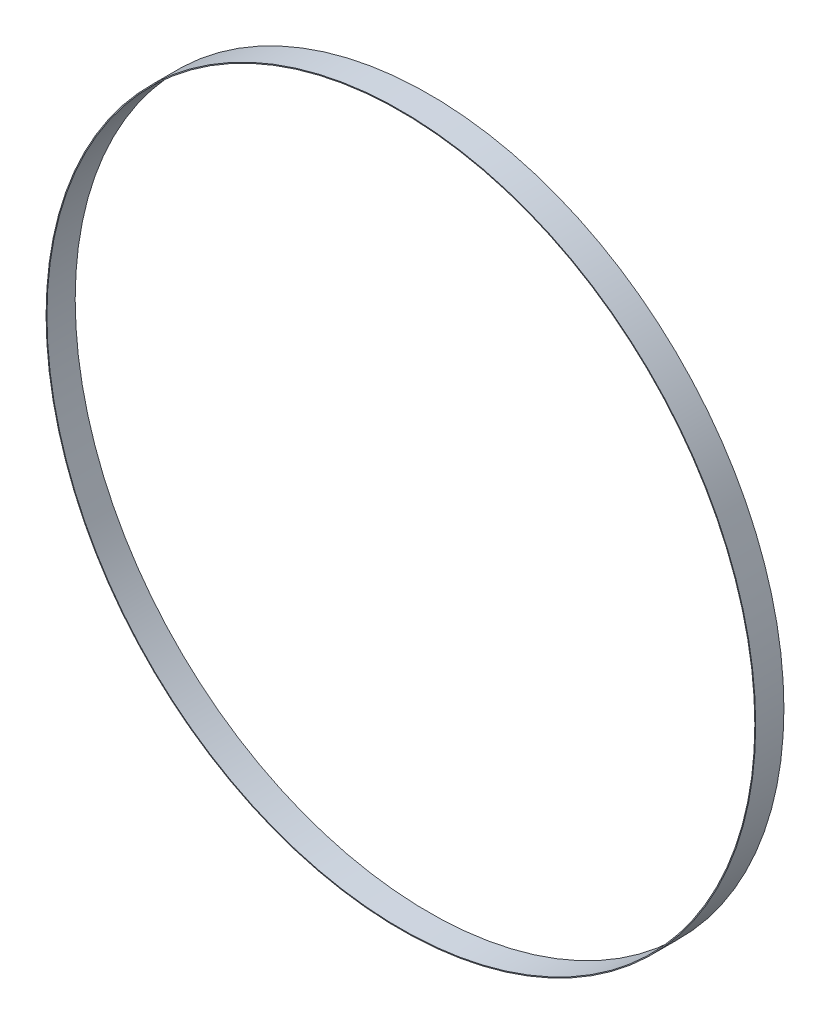
ISO-10303-21;
HEADER;
FILE_DESCRIPTION(('STEP AP214'),'2;1');
FILE_NAME('part.step','',(''),(''),'','','');
FILE_SCHEMA(('AUTOMOTIVE_DESIGN { 1 0 10303 214 1 1 1 1 }'));
ENDSEC;
DATA;
#1=APPLICATION_CONTEXT('core data for automotive mechanical design processes');
#2=APPLICATION_PROTOCOL_DEFINITION('international standard','automotive_design',2000,#1);
#3=PRODUCT_CONTEXT('',#1,'mechanical');
#4=PRODUCT('Part','Part','',(#3));
#5=PRODUCT_RELATED_PRODUCT_CATEGORY('part','',(#4));
#6=PRODUCT_DEFINITION_FORMATION('','',#4);
#7=PRODUCT_DEFINITION_CONTEXT('part definition',#1,'design');
#8=PRODUCT_DEFINITION('design','',#6,#7);
#9=PRODUCT_DEFINITION_SHAPE('','',#8);
#10=(LENGTH_UNIT() NAMED_UNIT(*) SI_UNIT(.MILLI.,.METRE.));
#11=(NAMED_UNIT(*) PLANE_ANGLE_UNIT() SI_UNIT($,.RADIAN.));
#12=(NAMED_UNIT(*) SI_UNIT($,.STERADIAN.) SOLID_ANGLE_UNIT());
#13=UNCERTAINTY_MEASURE_WITH_UNIT(LENGTH_MEASURE(1.E-05),#10,'distance_accuracy_value','');
#14=(GEOMETRIC_REPRESENTATION_CONTEXT(3) GLOBAL_UNCERTAINTY_ASSIGNED_CONTEXT((#13)) GLOBAL_UNIT_ASSIGNED_CONTEXT((#10,
#11,#12)) REPRESENTATION_CONTEXT('',''));
#15=CARTESIAN_POINT('',(0.,0.,0.));
#16=DIRECTION('',(0.,0.,1.));
#17=DIRECTION('',(1.,0.,0.));
#18=AXIS2_PLACEMENT_3D('',#15,#16,#17);
#19=CARTESIAN_POINT('',(0.,0.,100.));
#20=DIRECTION('',(0.,0.,1.));
#21=DIRECTION('',(1.,0.,0.));
#22=AXIS2_PLACEMENT_3D('',#19,#20,#21);
#23=PLANE('',#22);
#24=CARTESIAN_POINT('',(0.,0.,100.));
#25=DIRECTION('',(0.,0.,1.));
#26=DIRECTION('',(1.,0.,0.));
#27=AXIS2_PLACEMENT_3D('',#24,#25,#26);
#28=CIRCLE('',#27,1256.);
#29=CARTESIAN_POINT('',(1256.,0.,100.));
#30=VERTEX_POINT('',#29);
#31=EDGE_CURVE('E10',#30,#30,#28,.T.);
#32=ORIENTED_EDGE('',*,*,#31,.T.);
#33=EDGE_LOOP('',(#32));
#34=FACE_BOUND('',#33,.T.);
#35=CARTESIAN_POINT('',(0.,0.,100.));
#36=DIRECTION('',(0.,0.,1.));
#37=DIRECTION('',(1.,0.,0.));
#38=AXIS2_PLACEMENT_3D('',#35,#36,#37);
#39=CIRCLE('',#38,1253.);
#40=CARTESIAN_POINT('',(1253.,0.,100.));
#41=VERTEX_POINT('',#40);
#42=EDGE_CURVE('E41',#41,#41,#39,.T.);
#43=ORIENTED_EDGE('',*,*,#42,.F.);
#44=EDGE_LOOP('',(#43));
#45=FACE_BOUND('',#44,.T.);
#46=ADVANCED_FACE('F30',(#34,#45),#23,.T.);
#47=CARTESIAN_POINT('',(0.,0.,0.));
#48=DIRECTION('',(0.,0.,1.));
#49=DIRECTION('',(1.,0.,0.));
#50=AXIS2_PLACEMENT_3D('',#47,#48,#49);
#51=PLANE('',#50);
#52=CARTESIAN_POINT('',(0.,0.,0.));
#53=DIRECTION('',(0.,0.,1.));
#54=DIRECTION('',(1.,0.,0.));
#55=AXIS2_PLACEMENT_3D('',#52,#53,#54);
#56=CIRCLE('',#55,1256.);
#57=CARTESIAN_POINT('',(1256.,0.,0.));
#58=VERTEX_POINT('',#57);
#59=EDGE_CURVE('E34',#58,#58,#56,.T.);
#60=ORIENTED_EDGE('',*,*,#59,.F.);
#61=EDGE_LOOP('',(#60));
#62=FACE_BOUND('',#61,.T.);
#63=CARTESIAN_POINT('',(0.,0.,0.));
#64=DIRECTION('',(0.,0.,1.));
#65=DIRECTION('',(1.,0.,0.));
#66=AXIS2_PLACEMENT_3D('',#63,#64,#65);
#67=CIRCLE('',#66,1253.);
#68=CARTESIAN_POINT('',(1253.,0.,0.));
#69=VERTEX_POINT('',#68);
#70=EDGE_CURVE('E43',#69,#69,#67,.T.);
#71=ORIENTED_EDGE('',*,*,#70,.T.);
#72=EDGE_LOOP('',(#71));
#73=FACE_BOUND('',#72,.T.);
#74=ADVANCED_FACE('F53',(#62,#73),#51,.F.);
#75=CARTESIAN_POINT('',(0.,0.,100.));
#76=DIRECTION('',(0.,0.,-1.));
#77=DIRECTION('',(-1.,0.,0.));
#78=AXIS2_PLACEMENT_3D('',#75,#76,#77);
#79=CYLINDRICAL_SURFACE('',#78,1256.);
#80=ORIENTED_EDGE('',*,*,#31,.F.);
#81=EDGE_LOOP('',(#80));
#82=FACE_BOUND('',#81,.T.);
#83=ORIENTED_EDGE('',*,*,#59,.T.);
#84=EDGE_LOOP('',(#83));
#85=FACE_BOUND('',#84,.T.);
#86=ADVANCED_FACE('F32',(#82,#85),#79,.T.);
#87=CARTESIAN_POINT('',(0.,0.,100.));
#88=DIRECTION('',(0.,0.,-1.));
#89=DIRECTION('',(-1.,0.,0.));
#90=AXIS2_PLACEMENT_3D('',#87,#88,#89);
#91=CYLINDRICAL_SURFACE('',#90,1253.);
#92=ORIENTED_EDGE('',*,*,#42,.T.);
#93=EDGE_LOOP('',(#92));
#94=FACE_BOUND('',#93,.T.);
#95=ORIENTED_EDGE('',*,*,#70,.F.);
#96=EDGE_LOOP('',(#95));
#97=FACE_BOUND('',#96,.T.);
#98=ADVANCED_FACE('F49',(#94,#97),#91,.F.);
#99=CLOSED_SHELL('',(#46,#74,#86,#98));
#100=MANIFOLD_SOLID_BREP('B2',#99);
#101=ADVANCED_BREP_SHAPE_REPRESENTATION('',(#18,#100),#14);
#102=SHAPE_DEFINITION_REPRESENTATION(#9,#101);
ENDSEC;
END-ISO-10303-21;
